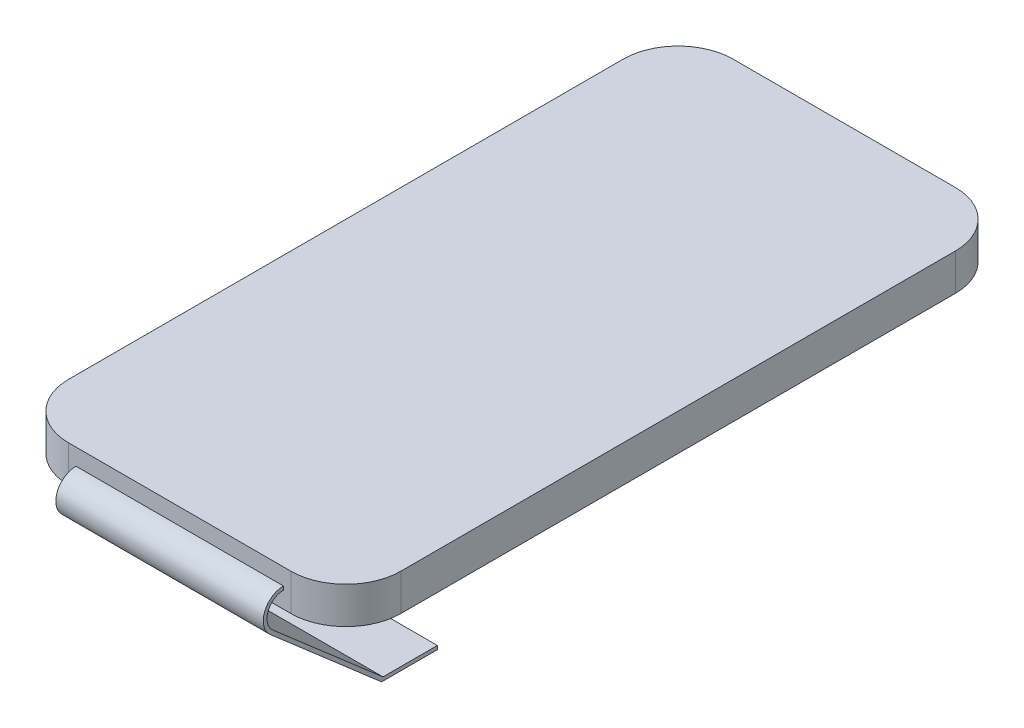
ISO-10303-21;
HEADER;
FILE_DESCRIPTION(('STEP AP214'),'2;1');
FILE_NAME('part.step','',(''),(''),'','','');
FILE_SCHEMA(('AUTOMOTIVE_DESIGN { 1 0 10303 214 1 1 1 1 }'));
ENDSEC;
DATA;
#1=APPLICATION_CONTEXT('core data for automotive mechanical design processes');
#2=APPLICATION_PROTOCOL_DEFINITION('international standard','automotive_design',2000,#1);
#3=PRODUCT_CONTEXT('',#1,'mechanical');
#4=PRODUCT('Part','Part','',(#3));
#5=PRODUCT_RELATED_PRODUCT_CATEGORY('part','',(#4));
#6=PRODUCT_DEFINITION_FORMATION('','',#4);
#7=PRODUCT_DEFINITION_CONTEXT('part definition',#1,'design');
#8=PRODUCT_DEFINITION('design','',#6,#7);
#9=PRODUCT_DEFINITION_SHAPE('','',#8);
#10=(LENGTH_UNIT() NAMED_UNIT(*) SI_UNIT(.MILLI.,.METRE.));
#11=(NAMED_UNIT(*) PLANE_ANGLE_UNIT() SI_UNIT($,.RADIAN.));
#12=(NAMED_UNIT(*) SI_UNIT($,.STERADIAN.) SOLID_ANGLE_UNIT());
#13=UNCERTAINTY_MEASURE_WITH_UNIT(LENGTH_MEASURE(1.E-05),#10,'distance_accuracy_value','');
#14=(GEOMETRIC_REPRESENTATION_CONTEXT(3) GLOBAL_UNCERTAINTY_ASSIGNED_CONTEXT((#13)) GLOBAL_UNIT_ASSIGNED_CONTEXT((#10,
#11,#12)) REPRESENTATION_CONTEXT('',''));
#15=CARTESIAN_POINT('',(0.,0.,0.));
#16=DIRECTION('',(0.,0.,1.));
#17=DIRECTION('',(1.,0.,0.));
#18=AXIS2_PLACEMENT_3D('',#15,#16,#17);
#19=CARTESIAN_POINT('',(9.05,2.,18.1));
#20=DIRECTION('',(-1.,0.,0.));
#21=DIRECTION('',(0.,0.,1.));
#22=AXIS2_PLACEMENT_3D('',#19,#20,#21);
#23=PLANE('',#22);
#24=DIRECTION('',(0.,0.,-1.));
#25=VECTOR('',#24,1.);
#26=CARTESIAN_POINT('',(9.05,0.,18.1));
#27=LINE('',#26,#25);
#28=CARTESIAN_POINT('',(9.05,0.,15.1));
#29=VERTEX_POINT('',#28);
#30=CARTESIAN_POINT('',(9.05,0.,-15.1));
#31=VERTEX_POINT('',#30);
#32=EDGE_CURVE('E172',#29,#31,#27,.T.);
#33=ORIENTED_EDGE('',*,*,#32,.T.);
#34=DIRECTION('',(0.,-1.,0.));
#35=VECTOR('',#34,1.);
#36=CARTESIAN_POINT('',(9.05,2.,-15.1));
#37=LINE('',#36,#35);
#38=CARTESIAN_POINT('',(9.05,2.,-15.1));
#39=VERTEX_POINT('',#38);
#40=EDGE_CURVE('E11',#31,#39,#37,.F.);
#41=ORIENTED_EDGE('',*,*,#40,.T.);
#42=DIRECTION('',(0.,0.,-1.));
#43=VECTOR('',#42,1.);
#44=CARTESIAN_POINT('',(9.05,2.,18.1));
#45=LINE('',#44,#43);
#46=CARTESIAN_POINT('',(9.05,2.,15.1));
#47=VERTEX_POINT('',#46);
#48=EDGE_CURVE('E181',#47,#39,#45,.T.);
#49=ORIENTED_EDGE('',*,*,#48,.F.);
#50=DIRECTION('',(0.,-1.,0.));
#51=VECTOR('',#50,1.);
#52=CARTESIAN_POINT('',(9.05,2.,15.1));
#53=LINE('',#52,#51);
#54=EDGE_CURVE('E49',#47,#29,#53,.T.);
#55=ORIENTED_EDGE('',*,*,#54,.T.);
#56=EDGE_LOOP('',(#33,#41,#49,#55));
#57=FACE_BOUND('',#56,.T.);
#58=ADVANCED_FACE('F41',(#57),#23,.F.);
#59=CARTESIAN_POINT('',(-9.05,2.,-18.1));
#60=DIRECTION('',(0.,0.,1.));
#61=DIRECTION('',(1.,0.,0.));
#62=AXIS2_PLACEMENT_3D('',#59,#60,#61);
#63=PLANE('',#62);
#64=DIRECTION('',(-1.,0.,0.));
#65=VECTOR('',#64,1.);
#66=CARTESIAN_POINT('',(-9.05,0.,-18.1));
#67=LINE('',#66,#65);
#68=CARTESIAN_POINT('',(6.05,0.,-18.1));
#69=VERTEX_POINT('',#68);
#70=CARTESIAN_POINT('',(-6.05,0.,-18.1));
#71=VERTEX_POINT('',#70);
#72=EDGE_CURVE('E175',#69,#71,#67,.T.);
#73=ORIENTED_EDGE('',*,*,#72,.T.);
#74=DIRECTION('',(0.,-1.,0.));
#75=VECTOR('',#74,1.);
#76=CARTESIAN_POINT('',(-6.05,2.,-18.1));
#77=LINE('',#76,#75);
#78=CARTESIAN_POINT('',(-6.05,2.,-18.1));
#79=VERTEX_POINT('',#78);
#80=EDGE_CURVE('E230',#71,#79,#77,.F.);
#81=ORIENTED_EDGE('',*,*,#80,.T.);
#82=DIRECTION('',(-1.,0.,0.));
#83=VECTOR('',#82,1.);
#84=CARTESIAN_POINT('',(-9.05,2.,-18.1));
#85=LINE('',#84,#83);
#86=CARTESIAN_POINT('',(6.05,2.,-18.1));
#87=VERTEX_POINT('',#86);
#88=EDGE_CURVE('E184',#87,#79,#85,.T.);
#89=ORIENTED_EDGE('',*,*,#88,.F.);
#90=DIRECTION('',(0.,-1.,0.));
#91=VECTOR('',#90,1.);
#92=CARTESIAN_POINT('',(6.05,2.,-18.1));
#93=LINE('',#92,#91);
#94=EDGE_CURVE('E227',#87,#69,#93,.T.);
#95=ORIENTED_EDGE('',*,*,#94,.T.);
#96=EDGE_LOOP('',(#73,#81,#89,#95));
#97=FACE_BOUND('',#96,.T.);
#98=ADVANCED_FACE('F249',(#97),#63,.F.);
#99=CARTESIAN_POINT('',(-9.05,2.,18.1));
#100=DIRECTION('',(1.,0.,0.));
#101=DIRECTION('',(0.,0.,-1.));
#102=AXIS2_PLACEMENT_3D('',#99,#100,#101);
#103=PLANE('',#102);
#104=DIRECTION('',(0.,0.,1.));
#105=VECTOR('',#104,1.);
#106=CARTESIAN_POINT('',(-9.05,0.,18.1));
#107=LINE('',#106,#105);
#108=CARTESIAN_POINT('',(-9.05,0.,-15.1));
#109=VERTEX_POINT('',#108);
#110=CARTESIAN_POINT('',(-9.05,0.,15.1));
#111=VERTEX_POINT('',#110);
#112=EDGE_CURVE('E197',#109,#111,#107,.T.);
#113=ORIENTED_EDGE('',*,*,#112,.T.);
#114=DIRECTION('',(0.,-1.,0.));
#115=VECTOR('',#114,1.);
#116=CARTESIAN_POINT('',(-9.05,2.,15.1));
#117=LINE('',#116,#115);
#118=CARTESIAN_POINT('',(-9.05,2.,15.1));
#119=VERTEX_POINT('',#118);
#120=EDGE_CURVE('E217',#111,#119,#117,.F.);
#121=ORIENTED_EDGE('',*,*,#120,.T.);
#122=DIRECTION('',(0.,0.,1.));
#123=VECTOR('',#122,1.);
#124=CARTESIAN_POINT('',(-9.05,2.,18.1));
#125=LINE('',#124,#123);
#126=CARTESIAN_POINT('',(-9.05,2.,-15.1));
#127=VERTEX_POINT('',#126);
#128=EDGE_CURVE('E188',#127,#119,#125,.T.);
#129=ORIENTED_EDGE('',*,*,#128,.F.);
#130=DIRECTION('',(0.,-1.,0.));
#131=VECTOR('',#130,1.);
#132=CARTESIAN_POINT('',(-9.05,2.,-15.1));
#133=LINE('',#132,#131);
#134=EDGE_CURVE('E214',#127,#109,#133,.T.);
#135=ORIENTED_EDGE('',*,*,#134,.T.);
#136=EDGE_LOOP('',(#113,#121,#129,#135));
#137=FACE_BOUND('',#136,.T.);
#138=ADVANCED_FACE('F260',(#137),#103,.F.);
#139=CARTESIAN_POINT('',(-9.05,2.,18.1));
#140=DIRECTION('',(0.,0.,-1.));
#141=DIRECTION('',(-1.,0.,0.));
#142=AXIS2_PLACEMENT_3D('',#139,#140,#141);
#143=PLANE('',#142);
#144=DIRECTION('',(-1.,0.,0.));
#145=VECTOR('',#144,1.);
#146=CARTESIAN_POINT('',(5.65,1.1,18.1));
#147=LINE('',#146,#145);
#148=CARTESIAN_POINT('',(5.65,1.1,18.1));
#149=VERTEX_POINT('',#148);
#150=CARTESIAN_POINT('',(-5.65,1.1,18.1));
#151=VERTEX_POINT('',#150);
#152=EDGE_CURVE('E56',#149,#151,#147,.T.);
#153=ORIENTED_EDGE('',*,*,#152,.F.);
#154=DIRECTION('',(0.,1.,0.));
#155=VECTOR('',#154,1.);
#156=CARTESIAN_POINT('',(5.65,1.1,18.1));
#157=LINE('',#156,#155);
#158=CARTESIAN_POINT('',(5.65,0.9,18.1));
#159=VERTEX_POINT('',#158);
#160=EDGE_CURVE('E60',#159,#149,#157,.T.);
#161=ORIENTED_EDGE('',*,*,#160,.F.);
#162=DIRECTION('',(-1.,0.,0.));
#163=VECTOR('',#162,1.);
#164=CARTESIAN_POINT('',(5.65,0.9,18.1));
#165=LINE('',#164,#163);
#166=CARTESIAN_POINT('',(-5.65,0.9,18.1));
#167=VERTEX_POINT('',#166);
#168=EDGE_CURVE('E454',#159,#167,#165,.T.);
#169=ORIENTED_EDGE('',*,*,#168,.T.);
#170=DIRECTION('',(0.,1.,0.));
#171=VECTOR('',#170,1.);
#172=CARTESIAN_POINT('',(-5.65,1.1,18.1));
#173=LINE('',#172,#171);
#174=EDGE_CURVE('E167',#167,#151,#173,.T.);
#175=ORIENTED_EDGE('',*,*,#174,.T.);
#176=EDGE_LOOP('',(#153,#161,#169,#175));
#177=FACE_BOUND('',#176,.T.);
#178=DIRECTION('',(1.,0.,0.));
#179=VECTOR('',#178,1.);
#180=CARTESIAN_POINT('',(-9.05,2.,18.1));
#181=LINE('',#180,#179);
#182=CARTESIAN_POINT('',(-6.05,2.,18.1));
#183=VERTEX_POINT('',#182);
#184=CARTESIAN_POINT('',(6.05,2.,18.1));
#185=VERTEX_POINT('',#184);
#186=EDGE_CURVE('E191',#183,#185,#181,.T.);
#187=ORIENTED_EDGE('',*,*,#186,.F.);
#188=DIRECTION('',(0.,-1.,0.));
#189=VECTOR('',#188,1.);
#190=CARTESIAN_POINT('',(-6.05,2.,18.1));
#191=LINE('',#190,#189);
#192=CARTESIAN_POINT('',(-6.05,0.,18.1));
#193=VERTEX_POINT('',#192);
#194=EDGE_CURVE('E203',#183,#193,#191,.T.);
#195=ORIENTED_EDGE('',*,*,#194,.T.);
#196=DIRECTION('',(1.,0.,0.));
#197=VECTOR('',#196,1.);
#198=CARTESIAN_POINT('',(-9.05,0.,18.1));
#199=LINE('',#198,#197);
#200=CARTESIAN_POINT('',(6.05,0.,18.1));
#201=VERTEX_POINT('',#200);
#202=EDGE_CURVE('E185',#193,#201,#199,.T.);
#203=ORIENTED_EDGE('',*,*,#202,.T.);
#204=DIRECTION('',(0.,-1.,0.));
#205=VECTOR('',#204,1.);
#206=CARTESIAN_POINT('',(6.05,2.,18.1));
#207=LINE('',#206,#205);
#208=EDGE_CURVE('E193',#201,#185,#207,.F.);
#209=ORIENTED_EDGE('',*,*,#208,.T.);
#210=EDGE_LOOP('',(#187,#195,#203,#209));
#211=FACE_BOUND('',#210,.T.);
#212=ADVANCED_FACE('F268',(#177,#211),#143,.F.);
#213=CARTESIAN_POINT('',(0.,2.,0.));
#214=DIRECTION('',(0.,-1.,0.));
#215=DIRECTION('',(0.,0.,-1.));
#216=AXIS2_PLACEMENT_3D('',#213,#214,#215);
#217=PLANE('',#216);
#218=ORIENTED_EDGE('',*,*,#128,.T.);
#219=CARTESIAN_POINT('',(-6.05,2.,15.1));
#220=DIRECTION('',(0.,-1.,0.));
#221=DIRECTION('',(0.,0.,-1.));
#222=AXIS2_PLACEMENT_3D('',#219,#220,#221);
#223=CIRCLE('',#222,3.);
#224=EDGE_CURVE('E225',#119,#183,#223,.F.);
#225=ORIENTED_EDGE('',*,*,#224,.T.);
#226=ORIENTED_EDGE('',*,*,#186,.T.);
#227=CARTESIAN_POINT('',(6.05,2.,15.1));
#228=DIRECTION('',(0.,-1.,0.));
#229=DIRECTION('',(0.,0.,-1.));
#230=AXIS2_PLACEMENT_3D('',#227,#228,#229);
#231=CIRCLE('',#230,3.);
#232=EDGE_CURVE('E219',#185,#47,#231,.F.);
#233=ORIENTED_EDGE('',*,*,#232,.T.);
#234=ORIENTED_EDGE('',*,*,#48,.T.);
#235=CARTESIAN_POINT('',(6.05,2.,-15.1));
#236=DIRECTION('',(0.,-1.,0.));
#237=DIRECTION('',(0.,0.,-1.));
#238=AXIS2_PLACEMENT_3D('',#235,#236,#237);
#239=CIRCLE('',#238,3.);
#240=EDGE_CURVE('E221',#39,#87,#239,.F.);
#241=ORIENTED_EDGE('',*,*,#240,.T.);
#242=ORIENTED_EDGE('',*,*,#88,.T.);
#243=CARTESIAN_POINT('',(-6.05,2.,-15.1));
#244=DIRECTION('',(0.,-1.,0.));
#245=DIRECTION('',(0.,0.,-1.));
#246=AXIS2_PLACEMENT_3D('',#243,#244,#245);
#247=CIRCLE('',#246,3.);
#248=EDGE_CURVE('E223',#79,#127,#247,.F.);
#249=ORIENTED_EDGE('',*,*,#248,.T.);
#250=EDGE_LOOP('',(#218,#225,#226,#233,#234,#241,#242,#249));
#251=FACE_BOUND('',#250,.T.);
#252=ADVANCED_FACE('F253',(#251),#217,.F.);
#253=CARTESIAN_POINT('',(0.,0.,0.));
#254=DIRECTION('',(0.,-1.,0.));
#255=DIRECTION('',(0.,0.,-1.));
#256=AXIS2_PLACEMENT_3D('',#253,#254,#255);
#257=PLANE('',#256);
#258=ORIENTED_EDGE('',*,*,#202,.F.);
#259=CARTESIAN_POINT('',(-6.05,0.,15.1));
#260=DIRECTION('',(0.,-1.,0.));
#261=DIRECTION('',(0.,0.,-1.));
#262=AXIS2_PLACEMENT_3D('',#259,#260,#261);
#263=CIRCLE('',#262,3.);
#264=EDGE_CURVE('E212',#193,#111,#263,.T.);
#265=ORIENTED_EDGE('',*,*,#264,.T.);
#266=ORIENTED_EDGE('',*,*,#112,.F.);
#267=CARTESIAN_POINT('',(-6.05,0.,-15.1));
#268=DIRECTION('',(0.,-1.,0.));
#269=DIRECTION('',(0.,0.,-1.));
#270=AXIS2_PLACEMENT_3D('',#267,#268,#269);
#271=CIRCLE('',#270,3.);
#272=EDGE_CURVE('E210',#109,#71,#271,.T.);
#273=ORIENTED_EDGE('',*,*,#272,.T.);
#274=ORIENTED_EDGE('',*,*,#72,.F.);
#275=CARTESIAN_POINT('',(6.05,0.,-15.1));
#276=DIRECTION('',(0.,-1.,0.));
#277=DIRECTION('',(0.,0.,-1.));
#278=AXIS2_PLACEMENT_3D('',#275,#276,#277);
#279=CIRCLE('',#278,3.);
#280=EDGE_CURVE('E208',#69,#31,#279,.T.);
#281=ORIENTED_EDGE('',*,*,#280,.T.);
#282=ORIENTED_EDGE('',*,*,#32,.F.);
#283=CARTESIAN_POINT('',(6.05,0.,15.1));
#284=DIRECTION('',(0.,-1.,0.));
#285=DIRECTION('',(0.,0.,-1.));
#286=AXIS2_PLACEMENT_3D('',#283,#284,#285);
#287=CIRCLE('',#286,3.);
#288=EDGE_CURVE('E206',#29,#201,#287,.T.);
#289=ORIENTED_EDGE('',*,*,#288,.T.);
#290=EDGE_LOOP('',(#258,#265,#266,#273,#274,#281,#282,#289));
#291=FACE_BOUND('',#290,.T.);
#292=ADVANCED_FACE('F241',(#291),#257,.T.);
#293=CARTESIAN_POINT('',(-6.05,2.,15.1));
#294=DIRECTION('',(0.,-1.,0.));
#295=DIRECTION('',(0.,0.,-1.));
#296=AXIS2_PLACEMENT_3D('',#293,#294,#295);
#297=CYLINDRICAL_SURFACE('',#296,3.);
#298=ORIENTED_EDGE('',*,*,#224,.F.);
#299=ORIENTED_EDGE('',*,*,#120,.F.);
#300=ORIENTED_EDGE('',*,*,#264,.F.);
#301=ORIENTED_EDGE('',*,*,#194,.F.);
#302=EDGE_LOOP('',(#298,#299,#300,#301));
#303=FACE_BOUND('',#302,.T.);
#304=ADVANCED_FACE('F265',(#303),#297,.T.);
#305=CARTESIAN_POINT('',(-6.05,2.,-15.1));
#306=DIRECTION('',(0.,-1.,0.));
#307=DIRECTION('',(0.,0.,-1.));
#308=AXIS2_PLACEMENT_3D('',#305,#306,#307);
#309=CYLINDRICAL_SURFACE('',#308,3.);
#310=ORIENTED_EDGE('',*,*,#248,.F.);
#311=ORIENTED_EDGE('',*,*,#80,.F.);
#312=ORIENTED_EDGE('',*,*,#272,.F.);
#313=ORIENTED_EDGE('',*,*,#134,.F.);
#314=EDGE_LOOP('',(#310,#311,#312,#313));
#315=FACE_BOUND('',#314,.T.);
#316=ADVANCED_FACE('F257',(#315),#309,.T.);
#317=CARTESIAN_POINT('',(6.05,2.,-15.1));
#318=DIRECTION('',(0.,-1.,0.));
#319=DIRECTION('',(0.,0.,-1.));
#320=AXIS2_PLACEMENT_3D('',#317,#318,#319);
#321=CYLINDRICAL_SURFACE('',#320,3.);
#322=ORIENTED_EDGE('',*,*,#240,.F.);
#323=ORIENTED_EDGE('',*,*,#40,.F.);
#324=ORIENTED_EDGE('',*,*,#280,.F.);
#325=ORIENTED_EDGE('',*,*,#94,.F.);
#326=EDGE_LOOP('',(#322,#323,#324,#325));
#327=FACE_BOUND('',#326,.T.);
#328=ADVANCED_FACE('F246',(#327),#321,.T.);
#329=CARTESIAN_POINT('',(6.05,2.,15.1));
#330=DIRECTION('',(0.,-1.,0.));
#331=DIRECTION('',(0.,0.,-1.));
#332=AXIS2_PLACEMENT_3D('',#329,#330,#331);
#333=CYLINDRICAL_SURFACE('',#332,3.);
#334=ORIENTED_EDGE('',*,*,#232,.F.);
#335=ORIENTED_EDGE('',*,*,#208,.F.);
#336=ORIENTED_EDGE('',*,*,#288,.F.);
#337=ORIENTED_EDGE('',*,*,#54,.F.);
#338=EDGE_LOOP('',(#334,#335,#336,#337));
#339=FACE_BOUND('',#338,.T.);
#340=ADVANCED_FACE('F43',(#339),#333,.T.);
#341=CARTESIAN_POINT('',(5.65,0.,18.1));
#342=DIRECTION('',(-1.,0.,0.));
#343=DIRECTION('',(0.,0.,1.));
#344=AXIS2_PLACEMENT_3D('',#341,#342,#343);
#345=CYLINDRICAL_SURFACE('',#344,1.1);
#346=CARTESIAN_POINT('',(-5.65,0.,18.1));
#347=DIRECTION('',(1.,0.,0.));
#348=DIRECTION('',(0.,0.,-1.));
#349=AXIS2_PLACEMENT_3D('',#346,#347,#348);
#350=CIRCLE('',#349,1.1);
#351=CARTESIAN_POINT('',(-5.65,-0.830606927735133,18.8211741340331));
#352=VERTEX_POINT('',#351);
#353=EDGE_CURVE('E171',#151,#352,#350,.T.);
#354=ORIENTED_EDGE('',*,*,#353,.T.);
#355=DIRECTION('',(-1.,0.,0.));
#356=VECTOR('',#355,1.);
#357=CARTESIAN_POINT('',(5.65,-0.830606927735133,18.8211741340331));
#358=LINE('',#357,#356);
#359=CARTESIAN_POINT('',(5.65,-0.830606927735133,18.8211741340331));
#360=VERTEX_POINT('',#359);
#361=EDGE_CURVE('E155',#360,#352,#358,.T.);
#362=ORIENTED_EDGE('',*,*,#361,.F.);
#363=CARTESIAN_POINT('',(5.65,0.,18.1));
#364=DIRECTION('',(1.,0.,0.));
#365=DIRECTION('',(0.,0.,-1.));
#366=AXIS2_PLACEMENT_3D('',#363,#364,#365);
#367=CIRCLE('',#366,1.1);
#368=EDGE_CURVE('E162',#149,#360,#367,.T.);
#369=ORIENTED_EDGE('',*,*,#368,.F.);
#370=ORIENTED_EDGE('',*,*,#152,.T.);
#371=EDGE_LOOP('',(#354,#362,#369,#370));
#372=FACE_BOUND('',#371,.T.);
#373=ADVANCED_FACE('F169',(#372),#345,.T.);
#374=CARTESIAN_POINT('',(5.65,-0.830606927735133,18.8211741340331));
#375=DIRECTION('',(0.,0.755097207031939,-0.655612849121008));
#376=DIRECTION('',(0.,0.655612849121008,0.755097207031939));
#377=AXIS2_PLACEMENT_3D('',#374,#375,#376);
#378=PLANE('',#377);
#379=DIRECTION('',(0.,-0.655612849121007,-0.755097207031939));
#380=VECTOR('',#379,1.);
#381=CARTESIAN_POINT('',(-5.65,-0.830606927735133,18.8211741340331));
#382=LINE('',#381,#380);
#383=CARTESIAN_POINT('',(-5.65,-6.1,12.752189981335));
#384=VERTEX_POINT('',#383);
#385=EDGE_CURVE('E435',#352,#384,#382,.T.);
#386=ORIENTED_EDGE('',*,*,#385,.T.);
#387=DIRECTION('',(-1.,0.,0.));
#388=VECTOR('',#387,1.);
#389=CARTESIAN_POINT('',(5.65,-6.1,12.752189981335));
#390=LINE('',#389,#388);
#391=CARTESIAN_POINT('',(5.65,-6.1,12.752189981335));
#392=VERTEX_POINT('',#391);
#393=EDGE_CURVE('E158',#392,#384,#390,.T.);
#394=ORIENTED_EDGE('',*,*,#393,.F.);
#395=DIRECTION('',(0.,-0.655612849121007,-0.755097207031939));
#396=VECTOR('',#395,1.);
#397=CARTESIAN_POINT('',(5.65,-0.830606927735133,18.8211741340331));
#398=LINE('',#397,#396);
#399=EDGE_CURVE('E151',#360,#392,#398,.T.);
#400=ORIENTED_EDGE('',*,*,#399,.F.);
#401=ORIENTED_EDGE('',*,*,#361,.T.);
#402=EDGE_LOOP('',(#386,#394,#400,#401));
#403=FACE_BOUND('',#402,.T.);
#404=ADVANCED_FACE('F153',(#403),#378,.F.);
#405=CARTESIAN_POINT('',(5.65,-6.1,12.752189981335));
#406=DIRECTION('',(0.,1.,0.));
#407=DIRECTION('',(0.,0.,1.));
#408=AXIS2_PLACEMENT_3D('',#405,#406,#407);
#409=PLANE('',#408);
#410=DIRECTION('',(0.,0.,-1.));
#411=VECTOR('',#410,1.);
#412=CARTESIAN_POINT('',(-5.65,-6.1,12.752189981335));
#413=LINE('',#412,#411);
#414=CARTESIAN_POINT('',(-5.65,-6.1,9.71483519286551));
#415=VERTEX_POINT('',#414);
#416=EDGE_CURVE('E437',#384,#415,#413,.T.);
#417=ORIENTED_EDGE('',*,*,#416,.T.);
#418=DIRECTION('',(-1.,0.,0.));
#419=VECTOR('',#418,1.);
#420=CARTESIAN_POINT('',(5.65,-6.1,9.71483519286551));
#421=LINE('',#420,#419);
#422=CARTESIAN_POINT('',(5.65,-6.1,9.71483519286551));
#423=VERTEX_POINT('',#422);
#424=EDGE_CURVE('E177',#423,#415,#421,.T.);
#425=ORIENTED_EDGE('',*,*,#424,.F.);
#426=DIRECTION('',(0.,0.,-1.));
#427=VECTOR('',#426,1.);
#428=CARTESIAN_POINT('',(5.65,-6.1,12.752189981335));
#429=LINE('',#428,#427);
#430=EDGE_CURVE('E161',#392,#423,#429,.T.);
#431=ORIENTED_EDGE('',*,*,#430,.F.);
#432=ORIENTED_EDGE('',*,*,#393,.T.);
#433=EDGE_LOOP('',(#417,#425,#431,#432));
#434=FACE_BOUND('',#433,.T.);
#435=ADVANCED_FACE('F318',(#434),#409,.F.);
#436=CARTESIAN_POINT('',(5.65,-6.1,9.71483519286551));
#437=DIRECTION('',(0.,0.,1.));
#438=DIRECTION('',(1.,0.,0.));
#439=AXIS2_PLACEMENT_3D('',#436,#437,#438);
#440=PLANE('',#439);
#441=DIRECTION('',(0.,1.,0.));
#442=VECTOR('',#441,1.);
#443=CARTESIAN_POINT('',(-5.65,-6.1,9.71483519286551));
#444=LINE('',#443,#442);
#445=CARTESIAN_POINT('',(-5.65,-5.9,9.71483519286551));
#446=VERTEX_POINT('',#445);
#447=EDGE_CURVE('E443',#415,#446,#444,.T.);
#448=ORIENTED_EDGE('',*,*,#447,.T.);
#449=DIRECTION('',(-1.,0.,0.));
#450=VECTOR('',#449,1.);
#451=CARTESIAN_POINT('',(5.65,-5.9,9.71483519286551));
#452=LINE('',#451,#450);
#453=CARTESIAN_POINT('',(5.65,-5.9,9.71483519286551));
#454=VERTEX_POINT('',#453);
#455=EDGE_CURVE('E462',#454,#446,#452,.T.);
#456=ORIENTED_EDGE('',*,*,#455,.F.);
#457=DIRECTION('',(0.,1.,0.));
#458=VECTOR('',#457,1.);
#459=CARTESIAN_POINT('',(5.65,-6.1,9.71483519286551));
#460=LINE('',#459,#458);
#461=EDGE_CURVE('E469',#423,#454,#460,.T.);
#462=ORIENTED_EDGE('',*,*,#461,.F.);
#463=ORIENTED_EDGE('',*,*,#424,.T.);
#464=EDGE_LOOP('',(#448,#456,#462,#463));
#465=FACE_BOUND('',#464,.T.);
#466=ADVANCED_FACE('F327',(#465),#440,.F.);
#467=CARTESIAN_POINT('',(5.65,-5.9,12.677480404396));
#468=DIRECTION('',(0.,-1.,0.));
#469=DIRECTION('',(0.,0.,-1.));
#470=AXIS2_PLACEMENT_3D('',#467,#468,#469);
#471=PLANE('',#470);
#472=DIRECTION('',(0.,0.,1.));
#473=VECTOR('',#472,1.);
#474=CARTESIAN_POINT('',(-5.65,-5.9,12.677480404396));
#475=LINE('',#474,#473);
#476=CARTESIAN_POINT('',(-5.65,-5.9,12.677480404396));
#477=VERTEX_POINT('',#476);
#478=EDGE_CURVE('E445',#446,#477,#475,.T.);
#479=ORIENTED_EDGE('',*,*,#478,.T.);
#480=DIRECTION('',(-1.,0.,0.));
#481=VECTOR('',#480,1.);
#482=CARTESIAN_POINT('',(5.65,-5.9,12.677480404396));
#483=LINE('',#482,#481);
#484=CARTESIAN_POINT('',(5.65,-5.9,12.677480404396));
#485=VERTEX_POINT('',#484);
#486=EDGE_CURVE('E459',#485,#477,#483,.T.);
#487=ORIENTED_EDGE('',*,*,#486,.F.);
#488=DIRECTION('',(0.,0.,1.));
#489=VECTOR('',#488,1.);
#490=CARTESIAN_POINT('',(5.65,-5.9,12.677480404396));
#491=LINE('',#490,#489);
#492=EDGE_CURVE('E479',#454,#485,#491,.T.);
#493=ORIENTED_EDGE('',*,*,#492,.F.);
#494=ORIENTED_EDGE('',*,*,#455,.T.);
#495=EDGE_LOOP('',(#479,#487,#493,#494));
#496=FACE_BOUND('',#495,.T.);
#497=ADVANCED_FACE('F337',(#496),#471,.F.);
#498=CARTESIAN_POINT('',(5.65,-0.679587486328745,18.6900515642089));
#499=DIRECTION('',(0.,-0.755097207031939,0.655612849121008));
#500=DIRECTION('',(0.,-0.655612849121008,-0.755097207031939));
#501=AXIS2_PLACEMENT_3D('',#498,#499,#500);
#502=PLANE('',#501);
#503=DIRECTION('',(0.,0.655612849121007,0.755097207031939));
#504=VECTOR('',#503,1.);
#505=CARTESIAN_POINT('',(-5.65,-0.679587486328745,18.6900515642089));
#506=LINE('',#505,#504);
#507=CARTESIAN_POINT('',(-5.65,-0.679587486328745,18.6900515642089));
#508=VERTEX_POINT('',#507);
#509=EDGE_CURVE('E447',#477,#508,#506,.T.);
#510=ORIENTED_EDGE('',*,*,#509,.T.);
#511=DIRECTION('',(-1.,0.,0.));
#512=VECTOR('',#511,1.);
#513=CARTESIAN_POINT('',(5.65,-0.679587486328745,18.6900515642089));
#514=LINE('',#513,#512);
#515=CARTESIAN_POINT('',(5.65,-0.679587486328745,18.6900515642089));
#516=VERTEX_POINT('',#515);
#517=EDGE_CURVE('E456',#516,#508,#514,.T.);
#518=ORIENTED_EDGE('',*,*,#517,.F.);
#519=DIRECTION('',(0.,0.655612849121007,0.755097207031939));
#520=VECTOR('',#519,1.);
#521=CARTESIAN_POINT('',(5.65,-0.679587486328745,18.6900515642089));
#522=LINE('',#521,#520);
#523=EDGE_CURVE('E476',#485,#516,#522,.T.);
#524=ORIENTED_EDGE('',*,*,#523,.F.);
#525=ORIENTED_EDGE('',*,*,#486,.T.);
#526=EDGE_LOOP('',(#510,#518,#524,#525));
#527=FACE_BOUND('',#526,.T.);
#528=ADVANCED_FACE('F347',(#527),#502,.F.);
#529=CARTESIAN_POINT('',(5.65,0.,18.1));
#530=DIRECTION('',(-1.,0.,0.));
#531=DIRECTION('',(0.,0.,1.));
#532=AXIS2_PLACEMENT_3D('',#529,#530,#531);
#533=CYLINDRICAL_SURFACE('',#532,0.9);
#534=CARTESIAN_POINT('',(-5.65,0.,18.1));
#535=DIRECTION('',(-1.,0.,0.));
#536=DIRECTION('',(0.,0.,-1.));
#537=AXIS2_PLACEMENT_3D('',#534,#535,#536);
#538=CIRCLE('',#537,0.9);
#539=EDGE_CURVE('E449',#508,#167,#538,.T.);
#540=ORIENTED_EDGE('',*,*,#539,.T.);
#541=ORIENTED_EDGE('',*,*,#168,.F.);
#542=CARTESIAN_POINT('',(5.65,0.,18.1));
#543=DIRECTION('',(-1.,0.,0.));
#544=DIRECTION('',(0.,0.,-1.));
#545=AXIS2_PLACEMENT_3D('',#542,#543,#544);
#546=CIRCLE('',#545,0.9);
#547=EDGE_CURVE('E478',#516,#159,#546,.T.);
#548=ORIENTED_EDGE('',*,*,#547,.F.);
#549=ORIENTED_EDGE('',*,*,#517,.T.);
#550=EDGE_LOOP('',(#540,#541,#548,#549));
#551=FACE_BOUND('',#550,.T.);
#552=ADVANCED_FACE('F357',(#551),#533,.F.);
#553=CARTESIAN_POINT('',(5.65,0.,18.1));
#554=DIRECTION('',(1.,0.,0.));
#555=DIRECTION('',(0.,0.,-1.));
#556=AXIS2_PLACEMENT_3D('',#553,#554,#555);
#557=PLANE('',#556);
#558=ORIENTED_EDGE('',*,*,#368,.T.);
#559=ORIENTED_EDGE('',*,*,#399,.T.);
#560=ORIENTED_EDGE('',*,*,#430,.T.);
#561=ORIENTED_EDGE('',*,*,#461,.T.);
#562=ORIENTED_EDGE('',*,*,#492,.T.);
#563=ORIENTED_EDGE('',*,*,#523,.T.);
#564=ORIENTED_EDGE('',*,*,#547,.T.);
#565=ORIENTED_EDGE('',*,*,#160,.T.);
#566=EDGE_LOOP('',(#558,#559,#560,#561,#562,#563,#564,#565));
#567=FACE_BOUND('',#566,.T.);
#568=ADVANCED_FACE('F165',(#567),#557,.T.);
#569=CARTESIAN_POINT('',(-5.65,0.,18.1));
#570=DIRECTION('',(1.,0.,0.));
#571=DIRECTION('',(0.,0.,-1.));
#572=AXIS2_PLACEMENT_3D('',#569,#570,#571);
#573=PLANE('',#572);
#574=ORIENTED_EDGE('',*,*,#353,.F.);
#575=ORIENTED_EDGE('',*,*,#174,.F.);
#576=ORIENTED_EDGE('',*,*,#539,.F.);
#577=ORIENTED_EDGE('',*,*,#509,.F.);
#578=ORIENTED_EDGE('',*,*,#478,.F.);
#579=ORIENTED_EDGE('',*,*,#447,.F.);
#580=ORIENTED_EDGE('',*,*,#416,.F.);
#581=ORIENTED_EDGE('',*,*,#385,.F.);
#582=EDGE_LOOP('',(#574,#575,#576,#577,#578,#579,#580,#581));
#583=FACE_BOUND('',#582,.T.);
#584=ADVANCED_FACE('F376',(#583),#573,.F.);
#585=CLOSED_SHELL('',(#58,#98,#138,#212,#252,#292,#304,#316,#328,#340,#373,#404,#435,#466,#497,
#528,#552,#568,#584));
#586=MANIFOLD_SOLID_BREP('B2',#585);
#587=ADVANCED_BREP_SHAPE_REPRESENTATION('',(#18,#586),#14);
#588=SHAPE_DEFINITION_REPRESENTATION(#9,#587);
ENDSEC;
END-ISO-10303-21;
